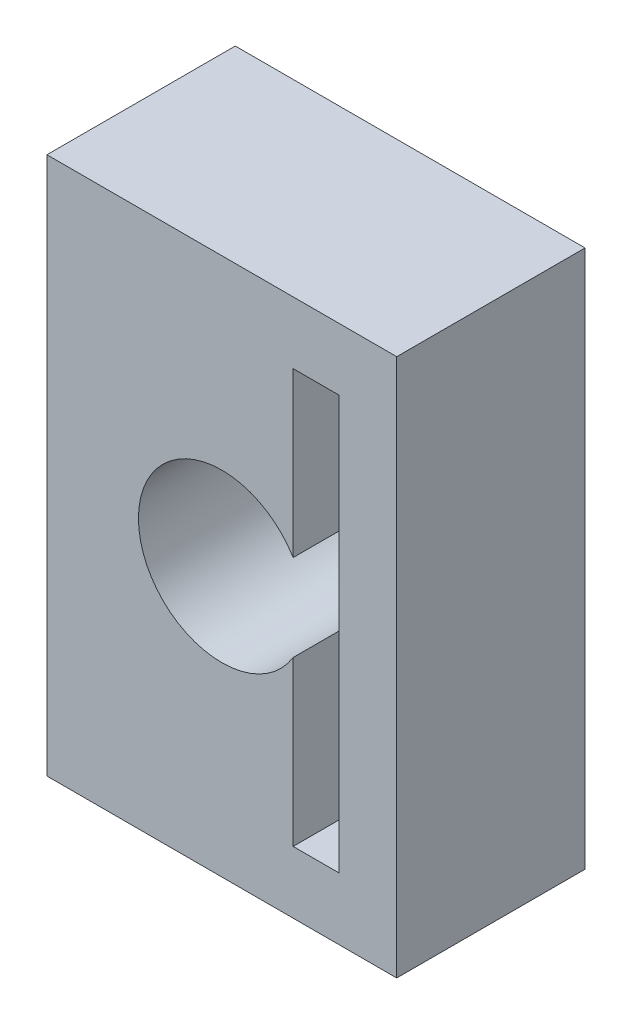
ISO-10303-21;
HEADER;
FILE_DESCRIPTION(('STEP AP214'),'2;1');
FILE_NAME('part.step','',(''),(''),'','','');
FILE_SCHEMA(('AUTOMOTIVE_DESIGN { 1 0 10303 214 1 1 1 1 }'));
ENDSEC;
DATA;
#1=APPLICATION_CONTEXT('core data for automotive mechanical design processes');
#2=APPLICATION_PROTOCOL_DEFINITION('international standard','automotive_design',2000,#1);
#3=PRODUCT_CONTEXT('',#1,'mechanical');
#4=PRODUCT('Part','Part','',(#3));
#5=PRODUCT_RELATED_PRODUCT_CATEGORY('part','',(#4));
#6=PRODUCT_DEFINITION_FORMATION('','',#4);
#7=PRODUCT_DEFINITION_CONTEXT('part definition',#1,'design');
#8=PRODUCT_DEFINITION('design','',#6,#7);
#9=PRODUCT_DEFINITION_SHAPE('','',#8);
#10=(LENGTH_UNIT() NAMED_UNIT(*) SI_UNIT(.MILLI.,.METRE.));
#11=(NAMED_UNIT(*) PLANE_ANGLE_UNIT() SI_UNIT($,.RADIAN.));
#12=(NAMED_UNIT(*) SI_UNIT($,.STERADIAN.) SOLID_ANGLE_UNIT());
#13=UNCERTAINTY_MEASURE_WITH_UNIT(LENGTH_MEASURE(1.E-05),#10,'distance_accuracy_value','');
#14=(GEOMETRIC_REPRESENTATION_CONTEXT(3) GLOBAL_UNCERTAINTY_ASSIGNED_CONTEXT((#13)) GLOBAL_UNIT_ASSIGNED_CONTEXT((#10,
#11,#12)) REPRESENTATION_CONTEXT('',''));
#15=CARTESIAN_POINT('',(0.,0.,0.));
#16=DIRECTION('',(0.,0.,1.));
#17=DIRECTION('',(1.,0.,0.));
#18=AXIS2_PLACEMENT_3D('',#15,#16,#17);
#19=CARTESIAN_POINT('',(-6.50000000000001,0.,6.));
#20=DIRECTION('',(-1.,0.,0.));
#21=DIRECTION('',(0.,0.,1.));
#22=AXIS2_PLACEMENT_3D('',#19,#20,#21);
#23=PLANE('',#22);
#24=DIRECTION('',(0.,0.,-1.));
#25=VECTOR('',#24,1.);
#26=CARTESIAN_POINT('',(-6.50000000000001,10.,6.));
#27=LINE('',#26,#25);
#28=CARTESIAN_POINT('',(-6.50000000000001,10.,6.));
#29=VERTEX_POINT('',#28);
#30=CARTESIAN_POINT('',(-6.50000000000001,10.,-1.));
#31=VERTEX_POINT('',#30);
#32=EDGE_CURVE('E60',#29,#31,#27,.T.);
#33=ORIENTED_EDGE('',*,*,#32,.T.);
#34=DIRECTION('',(0.,1.,0.));
#35=VECTOR('',#34,1.);
#36=CARTESIAN_POINT('',(-6.50000000000001,-10.,-1.));
#37=LINE('',#36,#35);
#38=CARTESIAN_POINT('',(-6.50000000000001,-10.,-1.));
#39=VERTEX_POINT('',#38);
#40=EDGE_CURVE('E169',#39,#31,#37,.T.);
#41=ORIENTED_EDGE('',*,*,#40,.F.);
#42=DIRECTION('',(0.,0.,-1.));
#43=VECTOR('',#42,1.);
#44=CARTESIAN_POINT('',(-6.50000000000001,-10.,6.));
#45=LINE('',#44,#43);
#46=CARTESIAN_POINT('',(-6.50000000000001,-10.,6.));
#47=VERTEX_POINT('',#46);
#48=EDGE_CURVE('E192',#47,#39,#45,.T.);
#49=ORIENTED_EDGE('',*,*,#48,.F.);
#50=DIRECTION('',(0.,1.,0.));
#51=VECTOR('',#50,1.);
#52=CARTESIAN_POINT('',(-6.50000000000001,0.,6.));
#53=LINE('',#52,#51);
#54=EDGE_CURVE('E178',#47,#29,#53,.T.);
#55=ORIENTED_EDGE('',*,*,#54,.T.);
#56=EDGE_LOOP('',(#33,#41,#49,#55));
#57=FACE_BOUND('',#56,.T.);
#58=ADVANCED_FACE('F38',(#57),#23,.T.);
#59=CARTESIAN_POINT('',(0.,-10.,6.));
#60=DIRECTION('',(0.,1.,0.));
#61=DIRECTION('',(0.,0.,1.));
#62=AXIS2_PLACEMENT_3D('',#59,#60,#61);
#63=PLANE('',#62);
#64=ORIENTED_EDGE('',*,*,#48,.T.);
#65=DIRECTION('',(-1.,0.,0.));
#66=VECTOR('',#65,1.);
#67=CARTESIAN_POINT('',(6.49999999999999,-10.,-1.));
#68=LINE('',#67,#66);
#69=CARTESIAN_POINT('',(6.49999999999999,-10.,-1.));
#70=VERTEX_POINT('',#69);
#71=EDGE_CURVE('E166',#70,#39,#68,.T.);
#72=ORIENTED_EDGE('',*,*,#71,.F.);
#73=DIRECTION('',(0.,0.,-1.));
#74=VECTOR('',#73,1.);
#75=CARTESIAN_POINT('',(6.49999999999999,-10.,6.));
#76=LINE('',#75,#74);
#77=CARTESIAN_POINT('',(6.49999999999999,-10.,6.));
#78=VERTEX_POINT('',#77);
#79=EDGE_CURVE('E190',#78,#70,#76,.T.);
#80=ORIENTED_EDGE('',*,*,#79,.F.);
#81=DIRECTION('',(1.,0.,0.));
#82=VECTOR('',#81,1.);
#83=CARTESIAN_POINT('',(0.,-10.,6.));
#84=LINE('',#83,#82);
#85=EDGE_CURVE('E180',#47,#78,#84,.T.);
#86=ORIENTED_EDGE('',*,*,#85,.F.);
#87=EDGE_LOOP('',(#64,#72,#80,#86));
#88=FACE_BOUND('',#87,.T.);
#89=ADVANCED_FACE('F211',(#88),#63,.F.);
#90=CARTESIAN_POINT('',(6.49999999999999,0.,6.));
#91=DIRECTION('',(-1.,0.,0.));
#92=DIRECTION('',(0.,0.,1.));
#93=AXIS2_PLACEMENT_3D('',#90,#91,#92);
#94=PLANE('',#93);
#95=ORIENTED_EDGE('',*,*,#79,.T.);
#96=DIRECTION('',(0.,-1.,0.));
#97=VECTOR('',#96,1.);
#98=CARTESIAN_POINT('',(6.49999999999999,10.,-1.));
#99=LINE('',#98,#97);
#100=CARTESIAN_POINT('',(6.49999999999999,10.,-1.));
#101=VERTEX_POINT('',#100);
#102=EDGE_CURVE('E175',#101,#70,#99,.T.);
#103=ORIENTED_EDGE('',*,*,#102,.F.);
#104=DIRECTION('',(0.,0.,-1.));
#105=VECTOR('',#104,1.);
#106=CARTESIAN_POINT('',(6.49999999999999,10.,6.));
#107=LINE('',#106,#105);
#108=CARTESIAN_POINT('',(6.49999999999999,10.,6.));
#109=VERTEX_POINT('',#108);
#110=EDGE_CURVE('E188',#109,#101,#107,.T.);
#111=ORIENTED_EDGE('',*,*,#110,.F.);
#112=DIRECTION('',(0.,1.,0.));
#113=VECTOR('',#112,1.);
#114=CARTESIAN_POINT('',(6.49999999999999,0.,6.));
#115=LINE('',#114,#113);
#116=EDGE_CURVE('E183',#78,#109,#115,.T.);
#117=ORIENTED_EDGE('',*,*,#116,.F.);
#118=EDGE_LOOP('',(#95,#103,#111,#117));
#119=FACE_BOUND('',#118,.T.);
#120=ADVANCED_FACE('F216',(#119),#94,.F.);
#121=CARTESIAN_POINT('',(0.,10.,6.));
#122=DIRECTION('',(0.,1.,0.));
#123=DIRECTION('',(0.,0.,1.));
#124=AXIS2_PLACEMENT_3D('',#121,#122,#123);
#125=PLANE('',#124);
#126=ORIENTED_EDGE('',*,*,#110,.T.);
#127=DIRECTION('',(1.,0.,0.));
#128=VECTOR('',#127,1.);
#129=CARTESIAN_POINT('',(-6.50000000000001,10.,-1.));
#130=LINE('',#129,#128);
#131=EDGE_CURVE('E172',#31,#101,#130,.T.);
#132=ORIENTED_EDGE('',*,*,#131,.F.);
#133=ORIENTED_EDGE('',*,*,#32,.F.);
#134=DIRECTION('',(1.,0.,0.));
#135=VECTOR('',#134,1.);
#136=CARTESIAN_POINT('',(0.,10.,6.));
#137=LINE('',#136,#135);
#138=EDGE_CURVE('E185',#29,#109,#137,.T.);
#139=ORIENTED_EDGE('',*,*,#138,.T.);
#140=EDGE_LOOP('',(#126,#132,#133,#139));
#141=FACE_BOUND('',#140,.T.);
#142=ADVANCED_FACE('F226',(#141),#125,.T.);
#143=CARTESIAN_POINT('',(0.,0.,6.));
#144=DIRECTION('',(0.,0.,1.));
#145=DIRECTION('',(1.,0.,0.));
#146=AXIS2_PLACEMENT_3D('',#143,#144,#145);
#147=PLANE('',#146);
#148=CARTESIAN_POINT('',(0.,0.,6.));
#149=DIRECTION('',(0.,0.,1.));
#150=DIRECTION('',(1.,0.,0.));
#151=AXIS2_PLACEMENT_3D('',#148,#149,#150);
#152=CIRCLE('',#151,3.1);
#153=CARTESIAN_POINT('',(2.65000000000399,-1.60857079420797,6.));
#154=VERTEX_POINT('',#153);
#155=CARTESIAN_POINT('',(2.65000000000399,1.60857079420797,6.));
#156=VERTEX_POINT('',#155);
#157=EDGE_CURVE('E131',#154,#156,#152,.F.);
#158=ORIENTED_EDGE('',*,*,#157,.T.);
#159=DIRECTION('',(0.,-1.,0.));
#160=VECTOR('',#159,1.);
#161=CARTESIAN_POINT('',(2.65000000000399,7.69000000000008,6.));
#162=LINE('',#161,#160);
#163=CARTESIAN_POINT('',(2.65000000000399,7.69000000000008,6.));
#164=VERTEX_POINT('',#163);
#165=EDGE_CURVE('E115',#164,#156,#162,.T.);
#166=ORIENTED_EDGE('',*,*,#165,.F.);
#167=DIRECTION('',(-1.,0.,0.));
#168=VECTOR('',#167,1.);
#169=CARTESIAN_POINT('',(2.65000000000399,7.69000000000008,6.));
#170=LINE('',#169,#168);
#171=CARTESIAN_POINT('',(4.35000000000401,7.69000000000008,6.));
#172=VERTEX_POINT('',#171);
#173=EDGE_CURVE('E152',#172,#164,#170,.T.);
#174=ORIENTED_EDGE('',*,*,#173,.F.);
#175=DIRECTION('',(0.,1.,0.));
#176=VECTOR('',#175,1.);
#177=CARTESIAN_POINT('',(4.35000000000401,7.69000000000008,6.));
#178=LINE('',#177,#176);
#179=CARTESIAN_POINT('',(4.35000000000401,-7.69000000000008,6.));
#180=VERTEX_POINT('',#179);
#181=EDGE_CURVE('E155',#180,#172,#178,.T.);
#182=ORIENTED_EDGE('',*,*,#181,.F.);
#183=DIRECTION('',(1.,0.,0.));
#184=VECTOR('',#183,1.);
#185=CARTESIAN_POINT('',(2.65000000000399,-7.69000000000008,6.));
#186=LINE('',#185,#184);
#187=CARTESIAN_POINT('',(2.65000000000399,-7.69000000000008,6.));
#188=VERTEX_POINT('',#187);
#189=EDGE_CURVE('E124',#188,#180,#186,.T.);
#190=ORIENTED_EDGE('',*,*,#189,.F.);
#191=EDGE_CURVE('E125',#154,#188,#162,.T.);
#192=ORIENTED_EDGE('',*,*,#191,.F.);
#193=EDGE_LOOP('',(#158,#166,#174,#182,#190,#192));
#194=FACE_BOUND('',#193,.T.);
#195=ORIENTED_EDGE('',*,*,#54,.F.);
#196=ORIENTED_EDGE('',*,*,#85,.T.);
#197=ORIENTED_EDGE('',*,*,#116,.T.);
#198=ORIENTED_EDGE('',*,*,#138,.F.);
#199=EDGE_LOOP('',(#195,#196,#197,#198));
#200=FACE_BOUND('',#199,.T.);
#201=ADVANCED_FACE('F133',(#194,#200),#147,.T.);
#202=CARTESIAN_POINT('',(0.,0.,-1.));
#203=DIRECTION('',(0.,0.,-1.));
#204=DIRECTION('',(-1.,0.,0.));
#205=AXIS2_PLACEMENT_3D('',#202,#203,#204);
#206=PLANE('',#205);
#207=ORIENTED_EDGE('',*,*,#71,.T.);
#208=ORIENTED_EDGE('',*,*,#40,.T.);
#209=ORIENTED_EDGE('',*,*,#131,.T.);
#210=ORIENTED_EDGE('',*,*,#102,.T.);
#211=EDGE_LOOP('',(#207,#208,#209,#210));
#212=FACE_BOUND('',#211,.T.);
#213=CARTESIAN_POINT('',(0.,0.,-1.));
#214=DIRECTION('',(0.,0.,-1.));
#215=DIRECTION('',(-1.,0.,0.));
#216=AXIS2_PLACEMENT_3D('',#213,#214,#215);
#217=CIRCLE('',#216,3.1);
#218=CARTESIAN_POINT('',(-3.1,0.,-1.));
#219=VERTEX_POINT('',#218);
#220=EDGE_CURVE('E139',#219,#219,#217,.T.);
#221=ORIENTED_EDGE('',*,*,#220,.F.);
#222=EDGE_LOOP('',(#221));
#223=FACE_BOUND('',#222,.T.);
#224=ADVANCED_FACE('F222',(#212,#223),#206,.T.);
#225=CARTESIAN_POINT('',(2.65000000000399,7.69000000000008,-15.4736679555949));
#226=DIRECTION('',(-1.,0.,0.));
#227=DIRECTION('',(0.,0.,1.));
#228=AXIS2_PLACEMENT_3D('',#225,#226,#227);
#229=PLANE('',#228);
#230=ORIENTED_EDGE('',*,*,#165,.T.);
#231=DIRECTION('',(0.,0.,-1.));
#232=VECTOR('',#231,1.);
#233=CARTESIAN_POINT('',(2.65000000000399,1.60857079420797,15.0509667991878));
#234=LINE('',#233,#232);
#235=CARTESIAN_POINT('',(2.65000000000399,1.60857079420797,2.));
#236=VERTEX_POINT('',#235);
#237=EDGE_CURVE('E11',#236,#156,#234,.F.);
#238=ORIENTED_EDGE('',*,*,#237,.F.);
#239=DIRECTION('',(0.,-1.,0.));
#240=VECTOR('',#239,1.);
#241=CARTESIAN_POINT('',(2.65000000000399,7.69000000000008,2.));
#242=LINE('',#241,#240);
#243=CARTESIAN_POINT('',(2.65000000000399,7.69000000000008,2.));
#244=VERTEX_POINT('',#243);
#245=EDGE_CURVE('E52',#244,#236,#242,.T.);
#246=ORIENTED_EDGE('',*,*,#245,.F.);
#247=DIRECTION('',(0.,0.,1.));
#248=VECTOR('',#247,1.);
#249=CARTESIAN_POINT('',(2.65000000000399,7.69000000000008,-15.4736679555949));
#250=LINE('',#249,#248);
#251=EDGE_CURVE('E119',#244,#164,#250,.T.);
#252=ORIENTED_EDGE('',*,*,#251,.T.);
#253=EDGE_LOOP('',(#230,#238,#246,#252));
#254=FACE_BOUND('',#253,.T.);
#255=ADVANCED_FACE('F116',(#254),#229,.F.);
#256=CARTESIAN_POINT('',(2.65000000000399,-7.69000000000008,-15.4736679555949));
#257=DIRECTION('',(0.,-1.,0.));
#258=DIRECTION('',(0.,0.,-1.));
#259=AXIS2_PLACEMENT_3D('',#256,#257,#258);
#260=PLANE('',#259);
#261=DIRECTION('',(0.,0.,1.));
#262=VECTOR('',#261,1.);
#263=CARTESIAN_POINT('',(4.35000000000401,-7.69000000000008,-15.4736679555949));
#264=LINE('',#263,#262);
#265=CARTESIAN_POINT('',(4.35000000000401,-7.69000000000008,2.));
#266=VERTEX_POINT('',#265);
#267=EDGE_CURVE('E154',#266,#180,#264,.T.);
#268=ORIENTED_EDGE('',*,*,#267,.F.);
#269=DIRECTION('',(1.,0.,0.));
#270=VECTOR('',#269,1.);
#271=CARTESIAN_POINT('',(2.65000000000399,-7.69000000000008,2.));
#272=LINE('',#271,#270);
#273=CARTESIAN_POINT('',(2.65000000000399,-7.69000000000008,2.));
#274=VERTEX_POINT('',#273);
#275=EDGE_CURVE('E148',#274,#266,#272,.T.);
#276=ORIENTED_EDGE('',*,*,#275,.F.);
#277=DIRECTION('',(0.,0.,1.));
#278=VECTOR('',#277,1.);
#279=CARTESIAN_POINT('',(2.65000000000399,-7.69000000000008,-15.4736679555949));
#280=LINE('',#279,#278);
#281=EDGE_CURVE('E161',#274,#188,#280,.T.);
#282=ORIENTED_EDGE('',*,*,#281,.T.);
#283=ORIENTED_EDGE('',*,*,#189,.T.);
#284=EDGE_LOOP('',(#268,#276,#282,#283));
#285=FACE_BOUND('',#284,.T.);
#286=ADVANCED_FACE('F255',(#285),#260,.F.);
#287=CARTESIAN_POINT('',(4.35000000000401,7.69000000000008,-15.4736679555949));
#288=DIRECTION('',(1.,0.,0.));
#289=DIRECTION('',(0.,0.,-1.));
#290=AXIS2_PLACEMENT_3D('',#287,#288,#289);
#291=PLANE('',#290);
#292=DIRECTION('',(0.,0.,1.));
#293=VECTOR('',#292,1.);
#294=CARTESIAN_POINT('',(4.35000000000401,7.69000000000008,-15.4736679555949));
#295=LINE('',#294,#293);
#296=CARTESIAN_POINT('',(4.35000000000401,7.69000000000008,2.));
#297=VERTEX_POINT('',#296);
#298=EDGE_CURVE('E162',#297,#172,#295,.T.);
#299=ORIENTED_EDGE('',*,*,#298,.F.);
#300=DIRECTION('',(0.,1.,0.));
#301=VECTOR('',#300,1.);
#302=CARTESIAN_POINT('',(4.35000000000401,-7.69000000000008,2.));
#303=LINE('',#302,#301);
#304=EDGE_CURVE('E150',#266,#297,#303,.T.);
#305=ORIENTED_EDGE('',*,*,#304,.F.);
#306=ORIENTED_EDGE('',*,*,#267,.T.);
#307=ORIENTED_EDGE('',*,*,#181,.T.);
#308=EDGE_LOOP('',(#299,#305,#306,#307));
#309=FACE_BOUND('',#308,.T.);
#310=ADVANCED_FACE('F258',(#309),#291,.F.);
#311=CARTESIAN_POINT('',(2.65000000000399,7.69000000000008,-15.4736679555949));
#312=DIRECTION('',(0.,1.,0.));
#313=DIRECTION('',(0.,0.,1.));
#314=AXIS2_PLACEMENT_3D('',#311,#312,#313);
#315=PLANE('',#314);
#316=ORIENTED_EDGE('',*,*,#251,.F.);
#317=DIRECTION('',(-1.,0.,0.));
#318=VECTOR('',#317,1.);
#319=CARTESIAN_POINT('',(4.35000000000401,7.69000000000008,2.));
#320=LINE('',#319,#318);
#321=EDGE_CURVE('E138',#297,#244,#320,.T.);
#322=ORIENTED_EDGE('',*,*,#321,.F.);
#323=ORIENTED_EDGE('',*,*,#298,.T.);
#324=ORIENTED_EDGE('',*,*,#173,.T.);
#325=EDGE_LOOP('',(#316,#322,#323,#324));
#326=FACE_BOUND('',#325,.T.);
#327=ADVANCED_FACE('F208',(#326),#315,.F.);
#328=ORIENTED_EDGE('',*,*,#281,.F.);
#329=DIRECTION('',(0.,-1.,0.));
#330=VECTOR('',#329,1.);
#331=CARTESIAN_POINT('',(2.65000000000399,-1.79373911145931,2.));
#332=LINE('',#331,#330);
#333=CARTESIAN_POINT('',(2.65000000000399,-1.60857079420797,2.));
#334=VERTEX_POINT('',#333);
#335=EDGE_CURVE('E146',#334,#274,#332,.T.);
#336=ORIENTED_EDGE('',*,*,#335,.F.);
#337=DIRECTION('',(0.,0.,-1.));
#338=VECTOR('',#337,1.);
#339=CARTESIAN_POINT('',(2.65000000000399,-1.60857079420797,15.0509667991878));
#340=LINE('',#339,#338);
#341=EDGE_CURVE('E45',#154,#334,#340,.T.);
#342=ORIENTED_EDGE('',*,*,#341,.F.);
#343=ORIENTED_EDGE('',*,*,#191,.T.);
#344=EDGE_LOOP('',(#328,#336,#342,#343));
#345=FACE_BOUND('',#344,.T.);
#346=ADVANCED_FACE('F196',(#345),#229,.F.);
#347=CARTESIAN_POINT('',(0.,0.,2.));
#348=DIRECTION('',(0.,0.,1.));
#349=DIRECTION('',(1.,0.,0.));
#350=AXIS2_PLACEMENT_3D('',#347,#348,#349);
#351=PLANE('',#350);
#352=ORIENTED_EDGE('',*,*,#321,.T.);
#353=ORIENTED_EDGE('',*,*,#245,.T.);
#354=CARTESIAN_POINT('',(0.,0.,2.));
#355=DIRECTION('',(0.,0.,1.));
#356=DIRECTION('',(1.,0.,0.));
#357=AXIS2_PLACEMENT_3D('',#354,#355,#356);
#358=CIRCLE('',#357,3.1);
#359=EDGE_CURVE('E132',#236,#334,#358,.F.);
#360=ORIENTED_EDGE('',*,*,#359,.T.);
#361=ORIENTED_EDGE('',*,*,#335,.T.);
#362=ORIENTED_EDGE('',*,*,#275,.T.);
#363=ORIENTED_EDGE('',*,*,#304,.T.);
#364=EDGE_LOOP('',(#352,#353,#360,#361,#362,#363));
#365=FACE_BOUND('',#364,.T.);
#366=ADVANCED_FACE('F198',(#365),#351,.T.);
#367=CARTESIAN_POINT('',(0.,0.,15.0509667991878));
#368=DIRECTION('',(0.,0.,-1.));
#369=DIRECTION('',(-1.,0.,0.));
#370=AXIS2_PLACEMENT_3D('',#367,#368,#369);
#371=CYLINDRICAL_SURFACE('',#370,3.1);
#372=ORIENTED_EDGE('',*,*,#220,.T.);
#373=EDGE_LOOP('',(#372));
#374=FACE_BOUND('',#373,.T.);
#375=ORIENTED_EDGE('',*,*,#359,.F.);
#376=ORIENTED_EDGE('',*,*,#237,.T.);
#377=ORIENTED_EDGE('',*,*,#157,.F.);
#378=ORIENTED_EDGE('',*,*,#341,.T.);
#379=EDGE_LOOP('',(#375,#376,#377,#378));
#380=FACE_BOUND('',#379,.T.);
#381=ADVANCED_FACE('F129',(#374,#380),#371,.F.);
#382=CLOSED_SHELL('',(#58,#89,#120,#142,#201,#224,#255,#286,#310,#327,#346,#366,#381));
#383=MANIFOLD_SOLID_BREP('B2',#382);
#384=ADVANCED_BREP_SHAPE_REPRESENTATION('',(#18,#383),#14);
#385=SHAPE_DEFINITION_REPRESENTATION(#9,#384);
ENDSEC;
END-ISO-10303-21;
